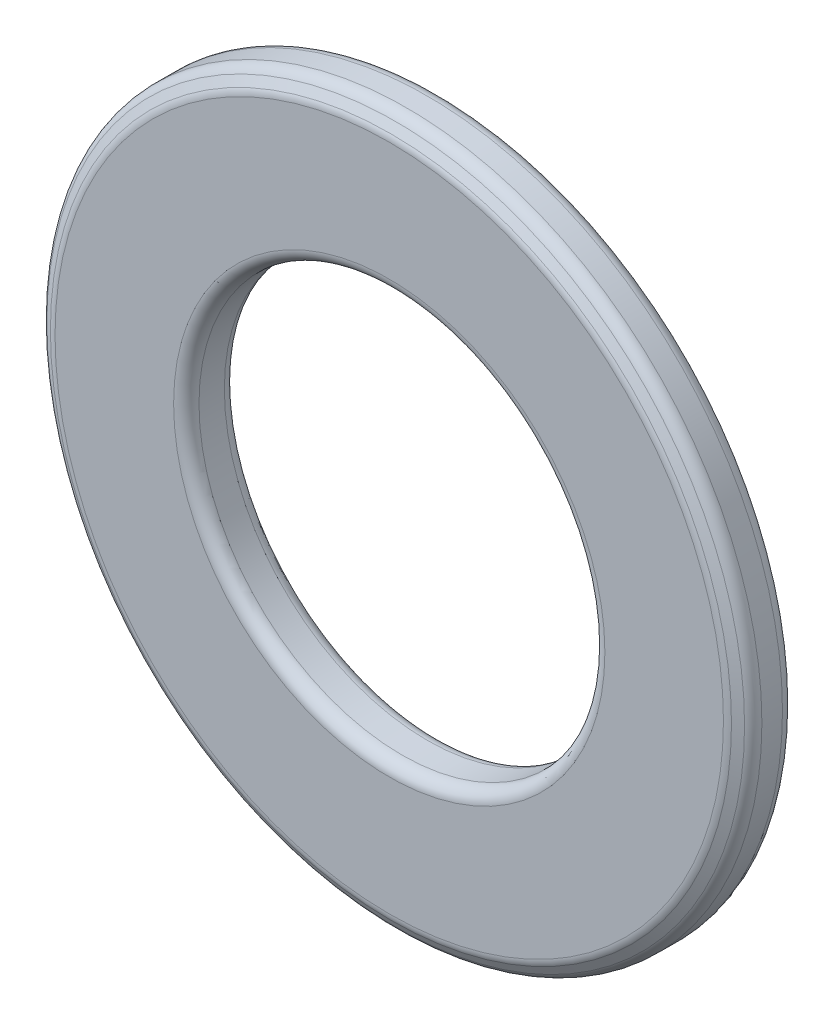
ISO-10303-21;
HEADER;
FILE_DESCRIPTION(('STEP AP214'),'2;1');
FILE_NAME('part.step','',(''),(''),'','','');
FILE_SCHEMA(('AUTOMOTIVE_DESIGN { 1 0 10303 214 1 1 1 1 }'));
ENDSEC;
DATA;
#1=APPLICATION_CONTEXT('core data for automotive mechanical design processes');
#2=APPLICATION_PROTOCOL_DEFINITION('international standard','automotive_design',2000,#1);
#3=PRODUCT_CONTEXT('',#1,'mechanical');
#4=PRODUCT('Part','Part','',(#3));
#5=PRODUCT_RELATED_PRODUCT_CATEGORY('part','',(#4));
#6=PRODUCT_DEFINITION_FORMATION('','',#4);
#7=PRODUCT_DEFINITION_CONTEXT('part definition',#1,'design');
#8=PRODUCT_DEFINITION('design','',#6,#7);
#9=PRODUCT_DEFINITION_SHAPE('','',#8);
#10=(LENGTH_UNIT() NAMED_UNIT(*) SI_UNIT(.MILLI.,.METRE.));
#11=(NAMED_UNIT(*) PLANE_ANGLE_UNIT() SI_UNIT($,.RADIAN.));
#12=(NAMED_UNIT(*) SI_UNIT($,.STERADIAN.) SOLID_ANGLE_UNIT());
#13=UNCERTAINTY_MEASURE_WITH_UNIT(LENGTH_MEASURE(1.E-05),#10,'distance_accuracy_value','');
#14=(GEOMETRIC_REPRESENTATION_CONTEXT(3) GLOBAL_UNCERTAINTY_ASSIGNED_CONTEXT((#13)) GLOBAL_UNIT_ASSIGNED_CONTEXT((#10,
#11,#12)) REPRESENTATION_CONTEXT('',''));
#15=CARTESIAN_POINT('',(0.,0.,0.));
#16=DIRECTION('',(0.,0.,1.));
#17=DIRECTION('',(1.,0.,0.));
#18=AXIS2_PLACEMENT_3D('',#15,#16,#17);
#19=CARTESIAN_POINT('',(15.2300359001178,-44.7825386860171,1.));
#20=DIRECTION('',(0.,0.,1.));
#21=DIRECTION('',(1.,0.,0.));
#22=AXIS2_PLACEMENT_3D('',#19,#20,#21);
#23=PLANE('',#22);
#24=CARTESIAN_POINT('',(15.2300359001178,-44.7825386860171,1.));
#25=DIRECTION('',(0.,0.,1.));
#26=DIRECTION('',(1.,0.,0.));
#27=AXIS2_PLACEMENT_3D('',#24,#25,#26);
#28=CIRCLE('',#27,4.25);
#29=CARTESIAN_POINT('',(19.4800359001178,-44.7825386860171,1.));
#30=VERTEX_POINT('',#29);
#31=EDGE_CURVE('E10',#30,#30,#28,.F.);
#32=ORIENTED_EDGE('',*,*,#31,.T.);
#33=EDGE_LOOP('',(#32));
#34=FACE_BOUND('',#33,.T.);
#35=CARTESIAN_POINT('',(15.2300359001178,-44.7825386860171,1.));
#36=DIRECTION('',(0.,0.,1.));
#37=DIRECTION('',(1.,0.,0.));
#38=AXIS2_PLACEMENT_3D('',#35,#36,#37);
#39=CIRCLE('',#38,6.58660254037844);
#40=CARTESIAN_POINT('',(21.8166384404963,-44.7825386860171,1.));
#41=VERTEX_POINT('',#40);
#42=EDGE_CURVE('E40',#41,#41,#39,.T.);
#43=ORIENTED_EDGE('',*,*,#42,.T.);
#44=EDGE_LOOP('',(#43));
#45=FACE_BOUND('',#44,.T.);
#46=ADVANCED_FACE('F33',(#34,#45),#23,.T.);
#47=CARTESIAN_POINT('',(15.2300359001178,-44.7825386860171,0.));
#48=DIRECTION('',(0.,0.,1.));
#49=DIRECTION('',(1.,0.,0.));
#50=AXIS2_PLACEMENT_3D('',#47,#48,#49);
#51=PLANE('',#50);
#52=CARTESIAN_POINT('',(15.2300359001178,-44.7825386860171,0.));
#53=DIRECTION('',(0.,0.,1.));
#54=DIRECTION('',(1.,0.,0.));
#55=AXIS2_PLACEMENT_3D('',#52,#53,#54);
#56=CIRCLE('',#55,4.25);
#57=CARTESIAN_POINT('',(19.4800359001178,-44.7825386860171,0.));
#58=VERTEX_POINT('',#57);
#59=EDGE_CURVE('E65',#58,#58,#56,.T.);
#60=ORIENTED_EDGE('',*,*,#59,.T.);
#61=EDGE_LOOP('',(#60));
#62=FACE_BOUND('',#61,.T.);
#63=CARTESIAN_POINT('',(15.2300359001178,-44.7825386860171,0.));
#64=DIRECTION('',(0.,0.,1.));
#65=DIRECTION('',(1.,0.,0.));
#66=AXIS2_PLACEMENT_3D('',#63,#64,#65);
#67=CIRCLE('',#66,6.75);
#68=CARTESIAN_POINT('',(21.9800359001178,-44.7825386860171,0.));
#69=VERTEX_POINT('',#68);
#70=EDGE_CURVE('E68',#69,#69,#67,.F.);
#71=ORIENTED_EDGE('',*,*,#70,.T.);
#72=EDGE_LOOP('',(#71));
#73=FACE_BOUND('',#72,.T.);
#74=ADVANCED_FACE('F72',(#62,#73),#51,.F.);
#75=CARTESIAN_POINT('',(15.2300359001178,-44.7825386860171,1.));
#76=DIRECTION('',(0.,0.,-1.));
#77=DIRECTION('',(-1.,0.,0.));
#78=AXIS2_PLACEMENT_3D('',#75,#76,#77);
#79=CYLINDRICAL_SURFACE('',#78,7.);
#80=CARTESIAN_POINT('',(15.2300359001178,-44.7825386860171,0.25));
#81=DIRECTION('',(0.,0.,1.));
#82=DIRECTION('',(1.,0.,0.));
#83=AXIS2_PLACEMENT_3D('',#80,#81,#82);
#84=CIRCLE('',#83,7.);
#85=CARTESIAN_POINT('',(22.2300359001178,-44.7825386860171,0.25));
#86=VERTEX_POINT('',#85);
#87=EDGE_CURVE('E53',#86,#86,#84,.T.);
#88=ORIENTED_EDGE('',*,*,#87,.T.);
#89=EDGE_LOOP('',(#88));
#90=FACE_BOUND('',#89,.T.);
#91=CARTESIAN_POINT('',(15.2300359001178,-44.7825386860171,0.655662432702595));
#92=DIRECTION('',(0.,0.,1.));
#93=DIRECTION('',(1.,0.,0.));
#94=AXIS2_PLACEMENT_3D('',#91,#92,#93);
#95=CIRCLE('',#94,7.);
#96=CARTESIAN_POINT('',(22.2300359001178,-44.7825386860171,0.655662432702595));
#97=VERTEX_POINT('',#96);
#98=EDGE_CURVE('E56',#97,#97,#95,.F.);
#99=ORIENTED_EDGE('',*,*,#98,.T.);
#100=EDGE_LOOP('',(#99));
#101=FACE_BOUND('',#100,.T.);
#102=ADVANCED_FACE('F82',(#90,#101),#79,.T.);
#103=CARTESIAN_POINT('',(15.2300359001178,-44.7825386860171,1.));
#104=DIRECTION('',(0.,0.,-1.));
#105=DIRECTION('',(-1.,0.,0.));
#106=AXIS2_PLACEMENT_3D('',#103,#104,#105);
#107=CYLINDRICAL_SURFACE('',#106,4.);
#108=CARTESIAN_POINT('',(15.2300359001178,-44.7825386860171,0.25));
#109=DIRECTION('',(0.,0.,1.));
#110=DIRECTION('',(1.,0.,0.));
#111=AXIS2_PLACEMENT_3D('',#108,#109,#110);
#112=CIRCLE('',#111,4.);
#113=CARTESIAN_POINT('',(19.2300359001178,-44.7825386860171,0.25));
#114=VERTEX_POINT('',#113);
#115=EDGE_CURVE('E59',#114,#114,#112,.F.);
#116=ORIENTED_EDGE('',*,*,#115,.T.);
#117=EDGE_LOOP('',(#116));
#118=FACE_BOUND('',#117,.T.);
#119=CARTESIAN_POINT('',(15.2300359001178,-44.7825386860171,0.75));
#120=DIRECTION('',(0.,0.,1.));
#121=DIRECTION('',(1.,0.,0.));
#122=AXIS2_PLACEMENT_3D('',#119,#120,#121);
#123=CIRCLE('',#122,4.);
#124=CARTESIAN_POINT('',(19.2300359001178,-44.7825386860171,0.75));
#125=VERTEX_POINT('',#124);
#126=EDGE_CURVE('E62',#125,#125,#123,.T.);
#127=ORIENTED_EDGE('',*,*,#126,.T.);
#128=EDGE_LOOP('',(#127));
#129=FACE_BOUND('',#128,.T.);
#130=ADVANCED_FACE('F85',(#118,#129),#107,.F.);
#131=CARTESIAN_POINT('',(15.2300359001178,-44.7825386860171,1.));
#132=DIRECTION('',(0.,0.,-1.));
#133=DIRECTION('',(-1.,0.,0.));
#134=AXIS2_PLACEMENT_3D('',#131,#132,#133);
#135=CONICAL_SURFACE('',#134,6.65358983848622,1.0471975511966);
#136=CARTESIAN_POINT('',(15.2300359001178,-44.7825386860171,0.872168783648706));
#137=DIRECTION('',(0.,0.,-1.));
#138=DIRECTION('',(-1.,0.,0.));
#139=AXIS2_PLACEMENT_3D('',#136,#137,#138);
#140=CIRCLE('',#139,6.875);
#141=CARTESIAN_POINT('',(8.35503590011784,-44.7825386860171,0.872168783648706));
#142=VERTEX_POINT('',#141);
#143=EDGE_CURVE('E44',#142,#142,#140,.F.);
#144=ORIENTED_EDGE('',*,*,#143,.T.);
#145=EDGE_LOOP('',(#144));
#146=FACE_BOUND('',#145,.T.);
#147=CARTESIAN_POINT('',(15.2300359001178,-44.7825386860171,0.96650635094611));
#148=DIRECTION('',(0.,0.,1.));
#149=DIRECTION('',(1.,0.,0.));
#150=AXIS2_PLACEMENT_3D('',#147,#148,#149);
#151=CIRCLE('',#150,6.71160254037844);
#152=CARTESIAN_POINT('',(21.9416384404963,-44.7825386860171,0.96650635094611));
#153=VERTEX_POINT('',#152);
#154=EDGE_CURVE('E48',#153,#153,#151,.F.);
#155=ORIENTED_EDGE('',*,*,#154,.T.);
#156=EDGE_LOOP('',(#155));
#157=FACE_BOUND('',#156,.T.);
#158=ADVANCED_FACE('F107',(#146,#157),#135,.T.);
#159=CARTESIAN_POINT('',(15.2300359001178,-44.7825386860171,0.25));
#160=DIRECTION('',(0.,0.,1.));
#161=DIRECTION('',(1.,0.,0.));
#162=AXIS2_PLACEMENT_3D('',#159,#160,#161);
#163=TOROIDAL_SURFACE('',#162,4.25,0.25);
#164=ORIENTED_EDGE('',*,*,#115,.F.);
#165=EDGE_LOOP('',(#164));
#166=FACE_BOUND('',#165,.T.);
#167=ORIENTED_EDGE('',*,*,#59,.F.);
#168=EDGE_LOOP('',(#167));
#169=FACE_BOUND('',#168,.T.);
#170=ADVANCED_FACE('F78',(#166,#169),#163,.T.);
#171=CARTESIAN_POINT('',(15.2300359001178,-44.7825386860171,0.25));
#172=DIRECTION('',(0.,0.,1.));
#173=DIRECTION('',(1.,0.,0.));
#174=AXIS2_PLACEMENT_3D('',#171,#172,#173);
#175=TOROIDAL_SURFACE('',#174,6.75,0.25);
#176=ORIENTED_EDGE('',*,*,#70,.F.);
#177=EDGE_LOOP('',(#176));
#178=FACE_BOUND('',#177,.T.);
#179=ORIENTED_EDGE('',*,*,#87,.F.);
#180=EDGE_LOOP('',(#179));
#181=FACE_BOUND('',#180,.T.);
#182=ADVANCED_FACE('F74',(#178,#181),#175,.T.);
#183=CARTESIAN_POINT('',(15.2300359001178,-44.7825386860171,0.655662432702595));
#184=DIRECTION('',(0.,0.,1.));
#185=DIRECTION('',(1.,0.,0.));
#186=AXIS2_PLACEMENT_3D('',#183,#184,#185);
#187=TOROIDAL_SURFACE('',#186,6.75,0.25);
#188=ORIENTED_EDGE('',*,*,#143,.F.);
#189=EDGE_LOOP('',(#188));
#190=FACE_BOUND('',#189,.T.);
#191=ORIENTED_EDGE('',*,*,#98,.F.);
#192=EDGE_LOOP('',(#191));
#193=FACE_BOUND('',#192,.T.);
#194=ADVANCED_FACE('F77',(#190,#193),#187,.T.);
#195=CARTESIAN_POINT('',(15.2300359001178,-44.7825386860171,0.75));
#196=DIRECTION('',(0.,0.,1.));
#197=DIRECTION('',(1.,0.,0.));
#198=AXIS2_PLACEMENT_3D('',#195,#196,#197);
#199=TOROIDAL_SURFACE('',#198,4.25,0.25);
#200=ORIENTED_EDGE('',*,*,#31,.F.);
#201=EDGE_LOOP('',(#200));
#202=FACE_BOUND('',#201,.T.);
#203=ORIENTED_EDGE('',*,*,#126,.F.);
#204=EDGE_LOOP('',(#203));
#205=FACE_BOUND('',#204,.T.);
#206=ADVANCED_FACE('F90',(#202,#205),#199,.T.);
#207=CARTESIAN_POINT('',(15.2300359001178,-44.7825386860171,0.75));
#208=DIRECTION('',(0.,0.,1.));
#209=DIRECTION('',(1.,0.,0.));
#210=AXIS2_PLACEMENT_3D('',#207,#208,#209);
#211=TOROIDAL_SURFACE('',#210,6.58660254037844,0.25);
#212=ORIENTED_EDGE('',*,*,#154,.F.);
#213=EDGE_LOOP('',(#212));
#214=FACE_BOUND('',#213,.T.);
#215=ORIENTED_EDGE('',*,*,#42,.F.);
#216=EDGE_LOOP('',(#215));
#217=FACE_BOUND('',#216,.T.);
#218=ADVANCED_FACE('F35',(#214,#217),#211,.T.);
#219=CLOSED_SHELL('',(#46,#74,#102,#130,#158,#170,#182,#194,#206,#218));
#220=MANIFOLD_SOLID_BREP('B2',#219);
#221=ADVANCED_BREP_SHAPE_REPRESENTATION('',(#18,#220),#14);
#222=SHAPE_DEFINITION_REPRESENTATION(#9,#221);
ENDSEC;
END-ISO-10303-21;
